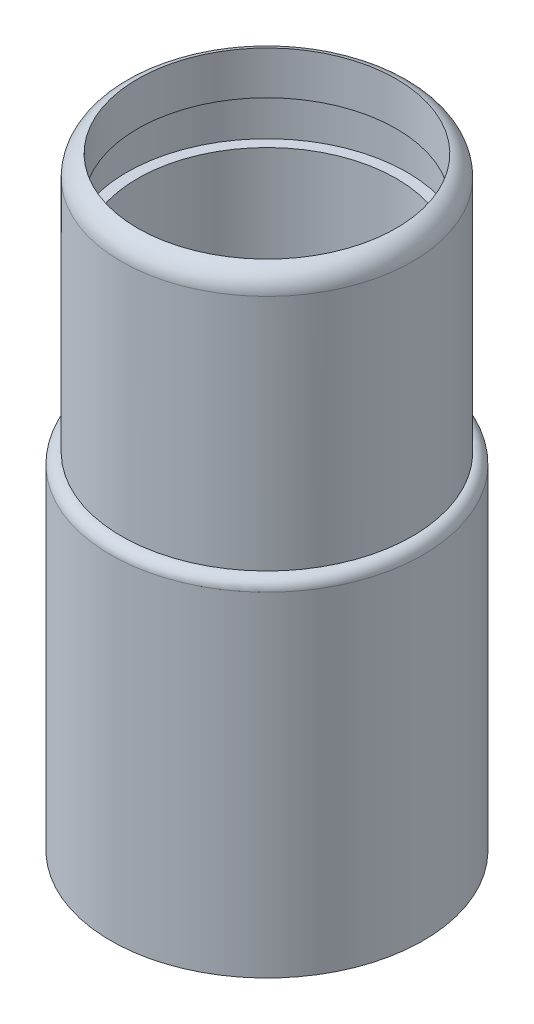
ISO-10303-21;
HEADER;
FILE_DESCRIPTION(('STEP AP214'),'2;1');
FILE_NAME('part.step','',(''),(''),'','','');
FILE_SCHEMA(('AUTOMOTIVE_DESIGN { 1 0 10303 214 1 1 1 1 }'));
ENDSEC;
DATA;
#1=APPLICATION_CONTEXT('core data for automotive mechanical design processes');
#2=APPLICATION_PROTOCOL_DEFINITION('international standard','automotive_design',2000,#1);
#3=PRODUCT_CONTEXT('',#1,'mechanical');
#4=PRODUCT('Part','Part','',(#3));
#5=PRODUCT_RELATED_PRODUCT_CATEGORY('part','',(#4));
#6=PRODUCT_DEFINITION_FORMATION('','',#4);
#7=PRODUCT_DEFINITION_CONTEXT('part definition',#1,'design');
#8=PRODUCT_DEFINITION('design','',#6,#7);
#9=PRODUCT_DEFINITION_SHAPE('','',#8);
#10=(LENGTH_UNIT() NAMED_UNIT(*) SI_UNIT(.MILLI.,.METRE.));
#11=(NAMED_UNIT(*) PLANE_ANGLE_UNIT() SI_UNIT($,.RADIAN.));
#12=(NAMED_UNIT(*) SI_UNIT($,.STERADIAN.) SOLID_ANGLE_UNIT());
#13=UNCERTAINTY_MEASURE_WITH_UNIT(LENGTH_MEASURE(1.E-05),#10,'distance_accuracy_value','');
#14=(GEOMETRIC_REPRESENTATION_CONTEXT(3) GLOBAL_UNCERTAINTY_ASSIGNED_CONTEXT((#13)) GLOBAL_UNIT_ASSIGNED_CONTEXT((#10,
#11,#12)) REPRESENTATION_CONTEXT('',''));
#15=CARTESIAN_POINT('',(0.,0.,0.));
#16=DIRECTION('',(0.,0.,1.));
#17=DIRECTION('',(1.,0.,0.));
#18=AXIS2_PLACEMENT_3D('',#15,#16,#17);
#19=CARTESIAN_POINT('',(0.,14.,0.));
#20=DIRECTION('',(0.,-1.,0.));
#21=DIRECTION('',(0.,0.,-1.));
#22=AXIS2_PLACEMENT_3D('',#19,#20,#21);
#23=CYLINDRICAL_SURFACE('',#22,3.);
#24=CARTESIAN_POINT('',(0.,14.,0.));
#25=DIRECTION('',(0.,1.,0.));
#26=DIRECTION('',(0.,0.,1.));
#27=AXIS2_PLACEMENT_3D('',#24,#25,#26);
#28=CIRCLE('',#27,3.);
#29=CARTESIAN_POINT('',(0.,14.,3.));
#30=VERTEX_POINT('',#29);
#31=EDGE_CURVE('E72',#30,#30,#28,.T.);
#32=ORIENTED_EDGE('',*,*,#31,.T.);
#33=EDGE_LOOP('',(#32));
#34=FACE_BOUND('',#33,.T.);
#35=CARTESIAN_POINT('',(0.,13.,0.));
#36=DIRECTION('',(0.,-1.,0.));
#37=DIRECTION('',(0.,0.,-1.));
#38=AXIS2_PLACEMENT_3D('',#35,#36,#37);
#39=CIRCLE('',#38,3.);
#40=CARTESIAN_POINT('',(0.,13.,-3.));
#41=VERTEX_POINT('',#40);
#42=EDGE_CURVE('E34',#41,#41,#39,.T.);
#43=ORIENTED_EDGE('',*,*,#42,.T.);
#44=EDGE_LOOP('',(#43));
#45=FACE_BOUND('',#44,.T.);
#46=ADVANCED_FACE('F30',(#34,#45),#23,.F.);
#47=CARTESIAN_POINT('',(0.,12.,0.));
#48=DIRECTION('',(0.,-1.,0.));
#49=DIRECTION('',(0.,0.,-1.));
#50=AXIS2_PLACEMENT_3D('',#47,#48,#49);
#51=CIRCLE('',#50,3.);
#52=CARTESIAN_POINT('',(0.,12.,-3.));
#53=VERTEX_POINT('',#52);
#54=EDGE_CURVE('E51',#53,#53,#51,.T.);
#55=ORIENTED_EDGE('',*,*,#54,.F.);
#56=EDGE_LOOP('',(#55));
#57=FACE_BOUND('',#56,.T.);
#58=CARTESIAN_POINT('',(0.,4.,0.));
#59=DIRECTION('',(0.,-1.,0.));
#60=DIRECTION('',(0.,0.,-1.));
#61=AXIS2_PLACEMENT_3D('',#58,#59,#60);
#62=CIRCLE('',#61,3.);
#63=CARTESIAN_POINT('',(0.,4.,-3.));
#64=VERTEX_POINT('',#63);
#65=EDGE_CURVE('E47',#64,#64,#62,.T.);
#66=ORIENTED_EDGE('',*,*,#65,.T.);
#67=EDGE_LOOP('',(#66));
#68=FACE_BOUND('',#67,.T.);
#69=ADVANCED_FACE('F93',(#57,#68),#23,.F.);
#70=CARTESIAN_POINT('',(0.,14.,0.));
#71=DIRECTION('',(0.,-1.,0.));
#72=DIRECTION('',(0.,0.,-1.));
#73=AXIS2_PLACEMENT_3D('',#70,#71,#72);
#74=CYLINDRICAL_SURFACE('',#73,3.375);
#75=CARTESIAN_POINT('',(0.,13.5158770817241,0.));
#76=DIRECTION('',(0.,1.,0.));
#77=DIRECTION('',(0.,0.,1.));
#78=AXIS2_PLACEMENT_3D('',#75,#76,#77);
#79=CIRCLE('',#78,3.375);
#80=CARTESIAN_POINT('',(0.,13.5158770817241,3.375));
#81=VERTEX_POINT('',#80);
#82=EDGE_CURVE('E10',#81,#81,#79,.F.);
#83=ORIENTED_EDGE('',*,*,#82,.T.);
#84=EDGE_LOOP('',(#83));
#85=FACE_BOUND('',#84,.T.);
#86=CARTESIAN_POINT('',(0.,8.,0.));
#87=DIRECTION('',(0.,-1.,0.));
#88=DIRECTION('',(0.,0.,-1.));
#89=AXIS2_PLACEMENT_3D('',#86,#87,#88);
#90=CIRCLE('',#89,3.375);
#91=CARTESIAN_POINT('',(0.,8.,-3.375));
#92=VERTEX_POINT('',#91);
#93=EDGE_CURVE('E43',#92,#92,#90,.T.);
#94=ORIENTED_EDGE('',*,*,#93,.F.);
#95=EDGE_LOOP('',(#94));
#96=FACE_BOUND('',#95,.T.);
#97=ADVANCED_FACE('F98',(#85,#96),#74,.T.);
#98=CARTESIAN_POINT('',(0.,0.,0.));
#99=DIRECTION('',(0.,1.,0.));
#100=DIRECTION('',(0.,0.,1.));
#101=AXIS2_PLACEMENT_3D('',#98,#99,#100);
#102=PLANE('',#101);
#103=CARTESIAN_POINT('',(0.,0.,0.));
#104=DIRECTION('',(0.,-1.,0.));
#105=DIRECTION('',(0.,0.,-1.));
#106=AXIS2_PLACEMENT_3D('',#103,#104,#105);
#107=CIRCLE('',#106,3.25);
#108=CARTESIAN_POINT('',(0.,0.,-3.25));
#109=VERTEX_POINT('',#108);
#110=EDGE_CURVE('E57',#109,#109,#107,.T.);
#111=ORIENTED_EDGE('',*,*,#110,.F.);
#112=EDGE_LOOP('',(#111));
#113=FACE_BOUND('',#112,.T.);
#114=CARTESIAN_POINT('',(0.,0.,0.));
#115=DIRECTION('',(0.,-1.,0.));
#116=DIRECTION('',(0.,0.,-1.));
#117=AXIS2_PLACEMENT_3D('',#114,#115,#116);
#118=CIRCLE('',#117,3.625);
#119=CARTESIAN_POINT('',(0.,0.,-3.625));
#120=VERTEX_POINT('',#119);
#121=EDGE_CURVE('E49',#120,#120,#118,.T.);
#122=ORIENTED_EDGE('',*,*,#121,.T.);
#123=EDGE_LOOP('',(#122));
#124=FACE_BOUND('',#123,.T.);
#125=ADVANCED_FACE('F102',(#113,#124),#102,.F.);
#126=CARTESIAN_POINT('',(0.,8.,0.));
#127=DIRECTION('',(0.,-1.,0.));
#128=DIRECTION('',(0.,0.,-1.));
#129=AXIS2_PLACEMENT_3D('',#126,#127,#128);
#130=CYLINDRICAL_SURFACE('',#129,3.625);
#131=CARTESIAN_POINT('',(0.,7.75,0.));
#132=DIRECTION('',(0.,-1.,0.));
#133=DIRECTION('',(0.,0.,-1.));
#134=AXIS2_PLACEMENT_3D('',#131,#132,#133);
#135=CIRCLE('',#134,3.625);
#136=CARTESIAN_POINT('',(0.,7.75,-3.625));
#137=VERTEX_POINT('',#136);
#138=EDGE_CURVE('E38',#137,#137,#135,.T.);
#139=ORIENTED_EDGE('',*,*,#138,.T.);
#140=EDGE_LOOP('',(#139));
#141=FACE_BOUND('',#140,.T.);
#142=ORIENTED_EDGE('',*,*,#121,.F.);
#143=EDGE_LOOP('',(#142));
#144=FACE_BOUND('',#143,.T.);
#145=ADVANCED_FACE('F90',(#141,#144),#130,.T.);
#146=CARTESIAN_POINT('',(0.,7.75,0.));
#147=DIRECTION('',(0.,-1.,0.));
#148=DIRECTION('',(0.,0.,-1.));
#149=AXIS2_PLACEMENT_3D('',#146,#147,#148);
#150=TOROIDAL_SURFACE('',#149,3.375,0.25);
#151=ORIENTED_EDGE('',*,*,#93,.T.);
#152=EDGE_LOOP('',(#151));
#153=FACE_BOUND('',#152,.T.);
#154=ORIENTED_EDGE('',*,*,#138,.F.);
#155=EDGE_LOOP('',(#154));
#156=FACE_BOUND('',#155,.T.);
#157=ADVANCED_FACE('F81',(#153,#156),#150,.T.);
#158=CARTESIAN_POINT('',(0.,13.5158770817241,0.));
#159=DIRECTION('',(0.,1.,0.));
#160=DIRECTION('',(0.,0.,1.));
#161=AXIS2_PLACEMENT_3D('',#158,#159,#160);
#162=TOROIDAL_SURFACE('',#161,2.875,0.5);
#163=ORIENTED_EDGE('',*,*,#82,.F.);
#164=EDGE_LOOP('',(#163));
#165=FACE_BOUND('',#164,.T.);
#166=ORIENTED_EDGE('',*,*,#31,.F.);
#167=EDGE_LOOP('',(#166));
#168=FACE_BOUND('',#167,.T.);
#169=ADVANCED_FACE('F32',(#165,#168),#162,.T.);
#170=CARTESIAN_POINT('',(0.,4.,0.));
#171=DIRECTION('',(0.,-1.,0.));
#172=DIRECTION('',(0.,0.,-1.));
#173=AXIS2_PLACEMENT_3D('',#170,#171,#172);
#174=CYLINDRICAL_SURFACE('',#173,3.25);
#175=CARTESIAN_POINT('',(0.,4.,0.));
#176=DIRECTION('',(0.,-1.,0.));
#177=DIRECTION('',(0.,0.,-1.));
#178=AXIS2_PLACEMENT_3D('',#175,#176,#177);
#179=CIRCLE('',#178,3.25);
#180=CARTESIAN_POINT('',(0.,4.,-3.25));
#181=VERTEX_POINT('',#180);
#182=EDGE_CURVE('E50',#181,#181,#179,.T.);
#183=ORIENTED_EDGE('',*,*,#182,.F.);
#184=EDGE_LOOP('',(#183));
#185=FACE_BOUND('',#184,.T.);
#186=ORIENTED_EDGE('',*,*,#110,.T.);
#187=EDGE_LOOP('',(#186));
#188=FACE_BOUND('',#187,.T.);
#189=ADVANCED_FACE('F80',(#185,#188),#174,.F.);
#190=CARTESIAN_POINT('',(0.,4.,0.));
#191=DIRECTION('',(0.,-1.,0.));
#192=DIRECTION('',(0.,0.,-1.));
#193=AXIS2_PLACEMENT_3D('',#190,#191,#192);
#194=PLANE('',#193);
#195=ORIENTED_EDGE('',*,*,#65,.F.);
#196=EDGE_LOOP('',(#195));
#197=FACE_BOUND('',#196,.T.);
#198=ORIENTED_EDGE('',*,*,#182,.T.);
#199=EDGE_LOOP('',(#198));
#200=FACE_BOUND('',#199,.T.);
#201=ADVANCED_FACE('F87',(#197,#200),#194,.T.);
#202=CARTESIAN_POINT('',(0.,13.,0.));
#203=DIRECTION('',(0.,-1.,0.));
#204=DIRECTION('',(0.,0.,-1.));
#205=AXIS2_PLACEMENT_3D('',#202,#203,#204);
#206=CYLINDRICAL_SURFACE('',#205,3.25);
#207=CARTESIAN_POINT('',(0.,13.,0.));
#208=DIRECTION('',(0.,-1.,0.));
#209=DIRECTION('',(0.,0.,-1.));
#210=AXIS2_PLACEMENT_3D('',#207,#208,#209);
#211=CIRCLE('',#210,3.25);
#212=CARTESIAN_POINT('',(0.,13.,-3.25));
#213=VERTEX_POINT('',#212);
#214=EDGE_CURVE('E53',#213,#213,#211,.T.);
#215=ORIENTED_EDGE('',*,*,#214,.F.);
#216=EDGE_LOOP('',(#215));
#217=FACE_BOUND('',#216,.T.);
#218=CARTESIAN_POINT('',(0.,12.,0.));
#219=DIRECTION('',(0.,-1.,0.));
#220=DIRECTION('',(0.,0.,-1.));
#221=AXIS2_PLACEMENT_3D('',#218,#219,#220);
#222=CIRCLE('',#221,3.25);
#223=CARTESIAN_POINT('',(0.,12.,-3.25));
#224=VERTEX_POINT('',#223);
#225=EDGE_CURVE('E59',#224,#224,#222,.T.);
#226=ORIENTED_EDGE('',*,*,#225,.T.);
#227=EDGE_LOOP('',(#226));
#228=FACE_BOUND('',#227,.T.);
#229=ADVANCED_FACE('F154',(#217,#228),#206,.F.);
#230=CARTESIAN_POINT('',(0.,13.,0.));
#231=DIRECTION('',(0.,-1.,0.));
#232=DIRECTION('',(0.,0.,-1.));
#233=AXIS2_PLACEMENT_3D('',#230,#231,#232);
#234=PLANE('',#233);
#235=ORIENTED_EDGE('',*,*,#42,.F.);
#236=EDGE_LOOP('',(#235));
#237=FACE_BOUND('',#236,.T.);
#238=ORIENTED_EDGE('',*,*,#214,.T.);
#239=EDGE_LOOP('',(#238));
#240=FACE_BOUND('',#239,.T.);
#241=ADVANCED_FACE('F174',(#237,#240),#234,.T.);
#242=CARTESIAN_POINT('',(0.,12.,0.));
#243=DIRECTION('',(0.,-1.,0.));
#244=DIRECTION('',(0.,0.,-1.));
#245=AXIS2_PLACEMENT_3D('',#242,#243,#244);
#246=PLANE('',#245);
#247=ORIENTED_EDGE('',*,*,#54,.T.);
#248=EDGE_LOOP('',(#247));
#249=FACE_BOUND('',#248,.T.);
#250=ORIENTED_EDGE('',*,*,#225,.F.);
#251=EDGE_LOOP('',(#250));
#252=FACE_BOUND('',#251,.T.);
#253=ADVANCED_FACE('F184',(#249,#252),#246,.F.);
#254=CLOSED_SHELL('',(#46,#69,#97,#125,#145,#157,#169,#189,#201,#229,#241,#253));
#255=MANIFOLD_SOLID_BREP('B2',#254);
#256=ADVANCED_BREP_SHAPE_REPRESENTATION('',(#18,#255),#14);
#257=SHAPE_DEFINITION_REPRESENTATION(#9,#256);
ENDSEC;
END-ISO-10303-21;
